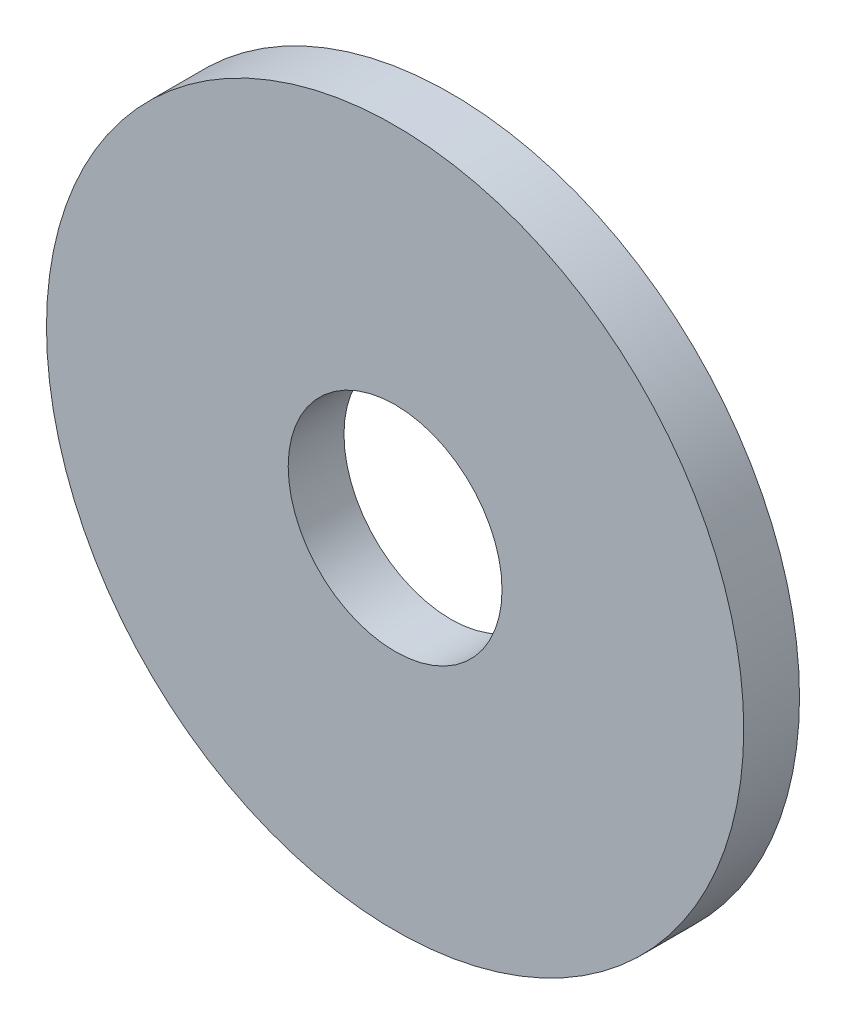
ISO-10303-21;
HEADER;
FILE_DESCRIPTION(('STEP AP214'),'2;1');
FILE_NAME('part.step','',(''),(''),'','','');
FILE_SCHEMA(('AUTOMOTIVE_DESIGN { 1 0 10303 214 1 1 1 1 }'));
ENDSEC;
DATA;
#1=APPLICATION_CONTEXT('core data for automotive mechanical design processes');
#2=APPLICATION_PROTOCOL_DEFINITION('international standard','automotive_design',2000,#1);
#3=PRODUCT_CONTEXT('',#1,'mechanical');
#4=PRODUCT('Part','Part','',(#3));
#5=PRODUCT_RELATED_PRODUCT_CATEGORY('part','',(#4));
#6=PRODUCT_DEFINITION_FORMATION('','',#4);
#7=PRODUCT_DEFINITION_CONTEXT('part definition',#1,'design');
#8=PRODUCT_DEFINITION('design','',#6,#7);
#9=PRODUCT_DEFINITION_SHAPE('','',#8);
#10=(LENGTH_UNIT() NAMED_UNIT(*) SI_UNIT(.MILLI.,.METRE.));
#11=(NAMED_UNIT(*) PLANE_ANGLE_UNIT() SI_UNIT($,.RADIAN.));
#12=(NAMED_UNIT(*) SI_UNIT($,.STERADIAN.) SOLID_ANGLE_UNIT());
#13=UNCERTAINTY_MEASURE_WITH_UNIT(LENGTH_MEASURE(1.E-05),#10,'distance_accuracy_value','');
#14=(GEOMETRIC_REPRESENTATION_CONTEXT(3) GLOBAL_UNCERTAINTY_ASSIGNED_CONTEXT((#13)) GLOBAL_UNIT_ASSIGNED_CONTEXT((#10,
#11,#12)) REPRESENTATION_CONTEXT('',''));
#15=CARTESIAN_POINT('',(0.,0.,0.));
#16=DIRECTION('',(0.,0.,1.));
#17=DIRECTION('',(1.,0.,0.));
#18=AXIS2_PLACEMENT_3D('',#15,#16,#17);
#19=CARTESIAN_POINT('',(0.,0.,1.2));
#20=DIRECTION('',(0.,0.,1.));
#21=DIRECTION('',(1.,0.,0.));
#22=AXIS2_PLACEMENT_3D('',#19,#20,#21);
#23=PLANE('',#22);
#24=CARTESIAN_POINT('',(0.,0.,1.2));
#25=DIRECTION('',(0.,0.,1.));
#26=DIRECTION('',(1.,0.,0.));
#27=AXIS2_PLACEMENT_3D('',#24,#25,#26);
#28=CIRCLE('',#27,7.5);
#29=CARTESIAN_POINT('',(7.5,0.,1.2));
#30=VERTEX_POINT('',#29);
#31=EDGE_CURVE('E10',#30,#30,#28,.T.);
#32=ORIENTED_EDGE('',*,*,#31,.T.);
#33=EDGE_LOOP('',(#32));
#34=FACE_BOUND('',#33,.T.);
#35=CARTESIAN_POINT('',(0.,0.,1.2));
#36=DIRECTION('',(0.,0.,1.));
#37=DIRECTION('',(1.,0.,0.));
#38=AXIS2_PLACEMENT_3D('',#35,#36,#37);
#39=CIRCLE('',#38,2.3);
#40=CARTESIAN_POINT('',(2.3,0.,1.2));
#41=VERTEX_POINT('',#40);
#42=EDGE_CURVE('E57',#41,#41,#39,.T.);
#43=ORIENTED_EDGE('',*,*,#42,.F.);
#44=EDGE_LOOP('',(#43));
#45=FACE_BOUND('',#44,.T.);
#46=ADVANCED_FACE('F43',(#34,#45),#23,.T.);
#47=CARTESIAN_POINT('',(0.,0.,0.));
#48=DIRECTION('',(0.,0.,1.));
#49=DIRECTION('',(1.,0.,0.));
#50=AXIS2_PLACEMENT_3D('',#47,#48,#49);
#51=PLANE('',#50);
#52=CARTESIAN_POINT('',(0.,0.,0.));
#53=DIRECTION('',(0.,0.,1.));
#54=DIRECTION('',(1.,0.,0.));
#55=AXIS2_PLACEMENT_3D('',#52,#53,#54);
#56=CIRCLE('',#55,7.5);
#57=CARTESIAN_POINT('',(7.5,0.,0.));
#58=VERTEX_POINT('',#57);
#59=EDGE_CURVE('E50',#58,#58,#56,.T.);
#60=ORIENTED_EDGE('',*,*,#59,.F.);
#61=EDGE_LOOP('',(#60));
#62=FACE_BOUND('',#61,.T.);
#63=CARTESIAN_POINT('',(0.,0.,0.));
#64=DIRECTION('',(0.,0.,1.));
#65=DIRECTION('',(1.,0.,0.));
#66=AXIS2_PLACEMENT_3D('',#63,#64,#65);
#67=CIRCLE('',#66,2.3);
#68=CARTESIAN_POINT('',(2.3,0.,0.));
#69=VERTEX_POINT('',#68);
#70=EDGE_CURVE('E59',#69,#69,#67,.T.);
#71=ORIENTED_EDGE('',*,*,#70,.T.);
#72=EDGE_LOOP('',(#71));
#73=FACE_BOUND('',#72,.T.);
#74=ADVANCED_FACE('F69',(#62,#73),#51,.F.);
#75=CARTESIAN_POINT('',(0.,0.,1.2));
#76=DIRECTION('',(0.,0.,-1.));
#77=DIRECTION('',(-1.,0.,0.));
#78=AXIS2_PLACEMENT_3D('',#75,#76,#77);
#79=CYLINDRICAL_SURFACE('',#78,7.5);
#80=ORIENTED_EDGE('',*,*,#31,.F.);
#81=EDGE_LOOP('',(#80));
#82=FACE_BOUND('',#81,.T.);
#83=ORIENTED_EDGE('',*,*,#59,.T.);
#84=EDGE_LOOP('',(#83));
#85=FACE_BOUND('',#84,.T.);
#86=ADVANCED_FACE('F44',(#82,#85),#79,.T.);
#87=CARTESIAN_POINT('',(0.,0.,1.2));
#88=DIRECTION('',(0.,0.,-1.));
#89=DIRECTION('',(-1.,0.,0.));
#90=AXIS2_PLACEMENT_3D('',#87,#88,#89);
#91=CYLINDRICAL_SURFACE('',#90,2.3);
#92=ORIENTED_EDGE('',*,*,#42,.T.);
#93=EDGE_LOOP('',(#92));
#94=FACE_BOUND('',#93,.T.);
#95=ORIENTED_EDGE('',*,*,#70,.F.);
#96=EDGE_LOOP('',(#95));
#97=FACE_BOUND('',#96,.T.);
#98=ADVANCED_FACE('F66',(#94,#97),#91,.F.);
#99=CLOSED_SHELL('',(#46,#74,#86,#98));
#100=MANIFOLD_SOLID_BREP('B2',#99);
#101=ADVANCED_BREP_SHAPE_REPRESENTATION('',(#18,#100),#14);
#102=SHAPE_DEFINITION_REPRESENTATION(#9,#101);
ENDSEC;
END-ISO-10303-21;
